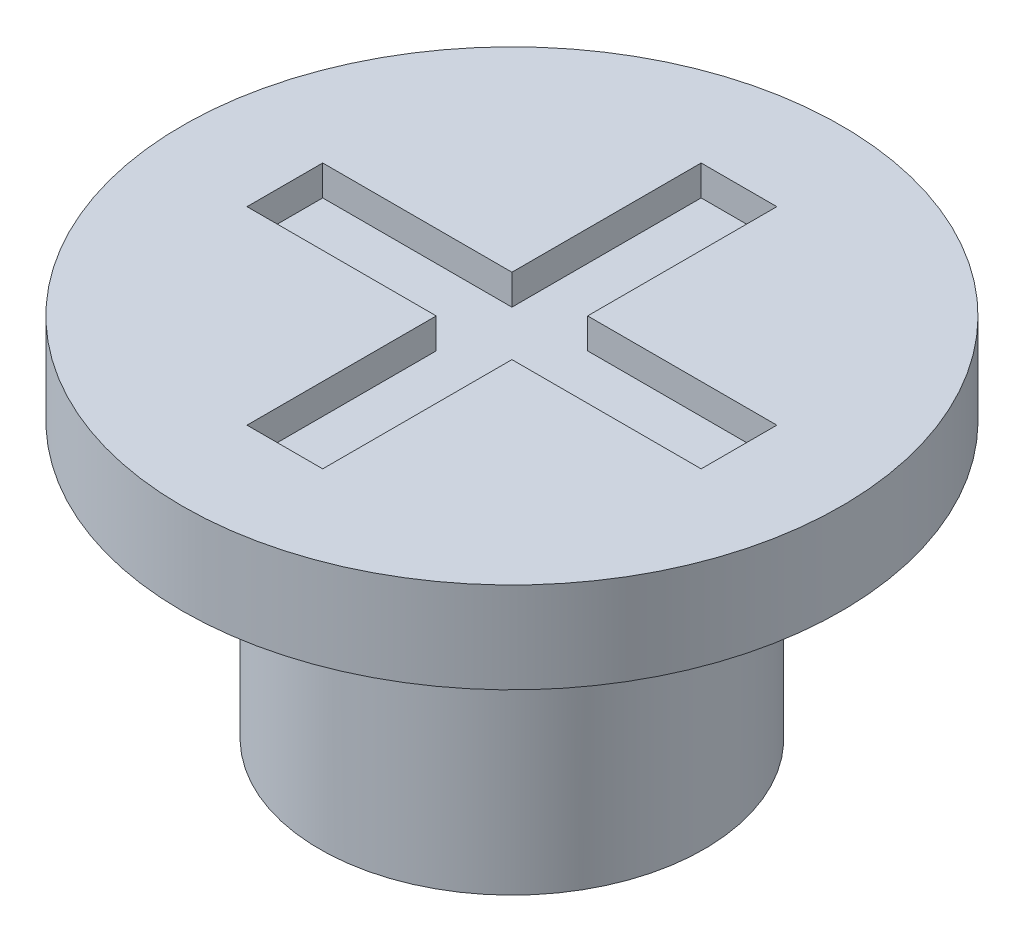
ISO-10303-21;
HEADER;
FILE_DESCRIPTION(('STEP AP214'),'2;1');
FILE_NAME('part.step','',(''),(''),'','','');
FILE_SCHEMA(('AUTOMOTIVE_DESIGN { 1 0 10303 214 1 1 1 1 }'));
ENDSEC;
DATA;
#1=APPLICATION_CONTEXT('core data for automotive mechanical design processes');
#2=APPLICATION_PROTOCOL_DEFINITION('international standard','automotive_design',2000,#1);
#3=PRODUCT_CONTEXT('',#1,'mechanical');
#4=PRODUCT('Part','Part','',(#3));
#5=PRODUCT_RELATED_PRODUCT_CATEGORY('part','',(#4));
#6=PRODUCT_DEFINITION_FORMATION('','',#4);
#7=PRODUCT_DEFINITION_CONTEXT('part definition',#1,'design');
#8=PRODUCT_DEFINITION('design','',#6,#7);
#9=PRODUCT_DEFINITION_SHAPE('','',#8);
#10=(LENGTH_UNIT() NAMED_UNIT(*) SI_UNIT(.MILLI.,.METRE.));
#11=(NAMED_UNIT(*) PLANE_ANGLE_UNIT() SI_UNIT($,.RADIAN.));
#12=(NAMED_UNIT(*) SI_UNIT($,.STERADIAN.) SOLID_ANGLE_UNIT());
#13=UNCERTAINTY_MEASURE_WITH_UNIT(LENGTH_MEASURE(1.E-05),#10,'distance_accuracy_value','');
#14=(GEOMETRIC_REPRESENTATION_CONTEXT(3) GLOBAL_UNCERTAINTY_ASSIGNED_CONTEXT((#13)) GLOBAL_UNIT_ASSIGNED_CONTEXT((#10,
#11,#12)) REPRESENTATION_CONTEXT('',''));
#15=CARTESIAN_POINT('',(0.,0.,0.));
#16=DIRECTION('',(0.,0.,1.));
#17=DIRECTION('',(1.,0.,0.));
#18=AXIS2_PLACEMENT_3D('',#15,#16,#17);
#19=CARTESIAN_POINT('',(0.,21.54,0.));
#20=DIRECTION('',(0.,-1.,0.));
#21=DIRECTION('',(0.,0.,-1.));
#22=AXIS2_PLACEMENT_3D('',#19,#20,#21);
#23=CYLINDRICAL_SURFACE('',#22,3.175);
#24=CARTESIAN_POINT('',(0.,21.54,0.));
#25=DIRECTION('',(0.,1.,0.));
#26=DIRECTION('',(0.,0.,1.));
#27=AXIS2_PLACEMENT_3D('',#24,#25,#26);
#28=CIRCLE('',#27,3.175);
#29=CARTESIAN_POINT('',(0.,21.54,3.175));
#30=VERTEX_POINT('',#29);
#31=EDGE_CURVE('E11',#30,#30,#28,.T.);
#32=ORIENTED_EDGE('',*,*,#31,.F.);
#33=EDGE_LOOP('',(#32));
#34=FACE_BOUND('',#33,.T.);
#35=CARTESIAN_POINT('',(0.,17.,0.));
#36=DIRECTION('',(0.,-1.,0.));
#37=DIRECTION('',(0.,0.,-1.));
#38=AXIS2_PLACEMENT_3D('',#35,#36,#37);
#39=CIRCLE('',#38,3.175);
#40=CARTESIAN_POINT('',(0.,17.,-3.175));
#41=VERTEX_POINT('',#40);
#42=EDGE_CURVE('E170',#41,#41,#39,.T.);
#43=ORIENTED_EDGE('',*,*,#42,.F.);
#44=EDGE_LOOP('',(#43));
#45=FACE_BOUND('',#44,.T.);
#46=ADVANCED_FACE('F43',(#34,#45),#23,.T.);
#47=CARTESIAN_POINT('',(0.,23.04,0.));
#48=DIRECTION('',(0.,-1.,0.));
#49=DIRECTION('',(0.,0.,-1.));
#50=AXIS2_PLACEMENT_3D('',#47,#48,#49);
#51=CYLINDRICAL_SURFACE('',#50,5.442868);
#52=CARTESIAN_POINT('',(0.,23.04,0.));
#53=DIRECTION('',(0.,1.,0.));
#54=DIRECTION('',(0.,0.,1.));
#55=AXIS2_PLACEMENT_3D('',#52,#53,#54);
#56=CIRCLE('',#55,5.442868);
#57=CARTESIAN_POINT('',(0.,23.04,5.442868));
#58=VERTEX_POINT('',#57);
#59=EDGE_CURVE('E50',#58,#58,#56,.T.);
#60=ORIENTED_EDGE('',*,*,#59,.F.);
#61=EDGE_LOOP('',(#60));
#62=FACE_BOUND('',#61,.T.);
#63=CARTESIAN_POINT('',(0.,21.54,0.));
#64=DIRECTION('',(0.,1.,0.));
#65=DIRECTION('',(0.,0.,1.));
#66=AXIS2_PLACEMENT_3D('',#63,#64,#65);
#67=CIRCLE('',#66,5.442868);
#68=CARTESIAN_POINT('',(0.,21.54,5.442868));
#69=VERTEX_POINT('',#68);
#70=EDGE_CURVE('E201',#69,#69,#67,.T.);
#71=ORIENTED_EDGE('',*,*,#70,.T.);
#72=EDGE_LOOP('',(#71));
#73=FACE_BOUND('',#72,.T.);
#74=ADVANCED_FACE('F223',(#62,#73),#51,.T.);
#75=CARTESIAN_POINT('',(0.,23.04,0.));
#76=DIRECTION('',(0.,1.,0.));
#77=DIRECTION('',(0.,0.,1.));
#78=AXIS2_PLACEMENT_3D('',#75,#76,#77);
#79=PLANE('',#78);
#80=DIRECTION('',(0.,0.,-1.));
#81=VECTOR('',#80,1.);
#82=CARTESIAN_POINT('',(0.625,23.04,0.));
#83=LINE('',#82,#81);
#84=CARTESIAN_POINT('',(0.625,23.04,3.75));
#85=VERTEX_POINT('',#84);
#86=CARTESIAN_POINT('',(0.625,23.04,0.625));
#87=VERTEX_POINT('',#86);
#88=EDGE_CURVE('E57',#85,#87,#83,.T.);
#89=ORIENTED_EDGE('',*,*,#88,.F.);
#90=DIRECTION('',(1.,0.,0.));
#91=VECTOR('',#90,1.);
#92=CARTESIAN_POINT('',(0.,23.04,3.75));
#93=LINE('',#92,#91);
#94=CARTESIAN_POINT('',(-0.625,23.04,3.75));
#95=VERTEX_POINT('',#94);
#96=EDGE_CURVE('E197',#95,#85,#93,.T.);
#97=ORIENTED_EDGE('',*,*,#96,.F.);
#98=DIRECTION('',(0.,0.,-1.));
#99=VECTOR('',#98,1.);
#100=CARTESIAN_POINT('',(-0.625,23.04,0.));
#101=LINE('',#100,#99);
#102=CARTESIAN_POINT('',(-0.625,23.04,0.625));
#103=VERTEX_POINT('',#102);
#104=EDGE_CURVE('E195',#95,#103,#101,.T.);
#105=ORIENTED_EDGE('',*,*,#104,.T.);
#106=DIRECTION('',(-1.,0.,0.));
#107=VECTOR('',#106,1.);
#108=CARTESIAN_POINT('',(0.,23.04,0.625));
#109=LINE('',#108,#107);
#110=CARTESIAN_POINT('',(-3.75,23.04,0.625000000000001));
#111=VERTEX_POINT('',#110);
#112=EDGE_CURVE('E152',#103,#111,#109,.T.);
#113=ORIENTED_EDGE('',*,*,#112,.T.);
#114=DIRECTION('',(0.,0.,-1.));
#115=VECTOR('',#114,1.);
#116=CARTESIAN_POINT('',(-3.75,23.04,0.));
#117=LINE('',#116,#115);
#118=CARTESIAN_POINT('',(-3.75,23.04,-0.624999999999999));
#119=VERTEX_POINT('',#118);
#120=EDGE_CURVE('E191',#111,#119,#117,.T.);
#121=ORIENTED_EDGE('',*,*,#120,.T.);
#122=DIRECTION('',(-1.,0.,0.));
#123=VECTOR('',#122,1.);
#124=CARTESIAN_POINT('',(0.,23.04,-0.625));
#125=LINE('',#124,#123);
#126=CARTESIAN_POINT('',(-0.625,23.04,-0.625));
#127=VERTEX_POINT('',#126);
#128=EDGE_CURVE('E188',#127,#119,#125,.T.);
#129=ORIENTED_EDGE('',*,*,#128,.F.);
#130=DIRECTION('',(0.,0.,-1.));
#131=VECTOR('',#130,1.);
#132=CARTESIAN_POINT('',(-0.625,23.04,0.));
#133=LINE('',#132,#131);
#134=CARTESIAN_POINT('',(-0.625,23.04,-3.75));
#135=VERTEX_POINT('',#134);
#136=EDGE_CURVE('E185',#127,#135,#133,.T.);
#137=ORIENTED_EDGE('',*,*,#136,.T.);
#138=DIRECTION('',(1.,0.,0.));
#139=VECTOR('',#138,1.);
#140=CARTESIAN_POINT('',(0.,23.04,-3.75));
#141=LINE('',#140,#139);
#142=CARTESIAN_POINT('',(0.625,23.04,-3.75));
#143=VERTEX_POINT('',#142);
#144=EDGE_CURVE('E182',#135,#143,#141,.T.);
#145=ORIENTED_EDGE('',*,*,#144,.T.);
#146=DIRECTION('',(0.,0.,-1.));
#147=VECTOR('',#146,1.);
#148=CARTESIAN_POINT('',(0.625,23.04,0.));
#149=LINE('',#148,#147);
#150=CARTESIAN_POINT('',(0.625,23.04,-0.625));
#151=VERTEX_POINT('',#150);
#152=EDGE_CURVE('E179',#151,#143,#149,.T.);
#153=ORIENTED_EDGE('',*,*,#152,.F.);
#154=DIRECTION('',(-1.,0.,0.));
#155=VECTOR('',#154,1.);
#156=CARTESIAN_POINT('',(0.,23.04,-0.625));
#157=LINE('',#156,#155);
#158=CARTESIAN_POINT('',(3.75,23.04,-0.625));
#159=VERTEX_POINT('',#158);
#160=EDGE_CURVE('E176',#159,#151,#157,.T.);
#161=ORIENTED_EDGE('',*,*,#160,.F.);
#162=DIRECTION('',(0.,0.,-1.));
#163=VECTOR('',#162,1.);
#164=CARTESIAN_POINT('',(3.75,23.04,0.));
#165=LINE('',#164,#163);
#166=CARTESIAN_POINT('',(3.75,23.04,0.625));
#167=VERTEX_POINT('',#166);
#168=EDGE_CURVE('E173',#167,#159,#165,.T.);
#169=ORIENTED_EDGE('',*,*,#168,.F.);
#170=DIRECTION('',(-1.,0.,0.));
#171=VECTOR('',#170,1.);
#172=CARTESIAN_POINT('',(0.,23.04,0.625));
#173=LINE('',#172,#171);
#174=EDGE_CURVE('E169',#167,#87,#173,.T.);
#175=ORIENTED_EDGE('',*,*,#174,.T.);
#176=EDGE_LOOP('',(#89,#97,#105,#113,#121,#129,#137,#145,#153,#161,#169,#175));
#177=FACE_BOUND('',#176,.T.);
#178=ORIENTED_EDGE('',*,*,#59,.T.);
#179=EDGE_LOOP('',(#178));
#180=FACE_BOUND('',#179,.T.);
#181=ADVANCED_FACE('F228',(#177,#180),#79,.T.);
#182=CARTESIAN_POINT('',(0.,21.54,0.));
#183=DIRECTION('',(0.,1.,0.));
#184=DIRECTION('',(0.,0.,1.));
#185=AXIS2_PLACEMENT_3D('',#182,#183,#184);
#186=PLANE('',#185);
#187=ORIENTED_EDGE('',*,*,#31,.T.);
#188=EDGE_LOOP('',(#187));
#189=FACE_BOUND('',#188,.T.);
#190=ORIENTED_EDGE('',*,*,#70,.F.);
#191=EDGE_LOOP('',(#190));
#192=FACE_BOUND('',#191,.T.);
#193=ADVANCED_FACE('F225',(#189,#192),#186,.F.);
#194=CARTESIAN_POINT('',(0.625,22.54,0.));
#195=DIRECTION('',(1.,0.,0.));
#196=DIRECTION('',(0.,0.,-1.));
#197=AXIS2_PLACEMENT_3D('',#194,#195,#196);
#198=PLANE('',#197);
#199=ORIENTED_EDGE('',*,*,#88,.T.);
#200=DIRECTION('',(0.,1.,0.));
#201=VECTOR('',#200,1.);
#202=CARTESIAN_POINT('',(0.625,22.54,0.625));
#203=LINE('',#202,#201);
#204=CARTESIAN_POINT('',(0.625,22.54,0.625));
#205=VERTEX_POINT('',#204);
#206=EDGE_CURVE('E167',#205,#87,#203,.T.);
#207=ORIENTED_EDGE('',*,*,#206,.F.);
#208=DIRECTION('',(0.,0.,-1.));
#209=VECTOR('',#208,1.);
#210=CARTESIAN_POINT('',(0.625,22.54,0.));
#211=LINE('',#210,#209);
#212=CARTESIAN_POINT('',(0.625,22.54,3.75));
#213=VERTEX_POINT('',#212);
#214=EDGE_CURVE('E199',#213,#205,#211,.T.);
#215=ORIENTED_EDGE('',*,*,#214,.F.);
#216=DIRECTION('',(0.,1.,0.));
#217=VECTOR('',#216,1.);
#218=CARTESIAN_POINT('',(0.625,22.54,3.75));
#219=LINE('',#218,#217);
#220=EDGE_CURVE('E65',#213,#85,#219,.T.);
#221=ORIENTED_EDGE('',*,*,#220,.T.);
#222=EDGE_LOOP('',(#199,#207,#215,#221));
#223=FACE_BOUND('',#222,.T.);
#224=ADVANCED_FACE('F227',(#223),#198,.F.);
#225=CARTESIAN_POINT('',(0.,22.54,3.75));
#226=DIRECTION('',(0.,0.,1.));
#227=DIRECTION('',(1.,0.,0.));
#228=AXIS2_PLACEMENT_3D('',#225,#226,#227);
#229=PLANE('',#228);
#230=ORIENTED_EDGE('',*,*,#96,.T.);
#231=ORIENTED_EDGE('',*,*,#220,.F.);
#232=DIRECTION('',(1.,0.,0.));
#233=VECTOR('',#232,1.);
#234=CARTESIAN_POINT('',(0.,22.54,3.75));
#235=LINE('',#234,#233);
#236=CARTESIAN_POINT('',(-0.625,22.54,3.75));
#237=VERTEX_POINT('',#236);
#238=EDGE_CURVE('E145',#237,#213,#235,.T.);
#239=ORIENTED_EDGE('',*,*,#238,.F.);
#240=DIRECTION('',(0.,1.,0.));
#241=VECTOR('',#240,1.);
#242=CARTESIAN_POINT('',(-0.625,22.54,3.75));
#243=LINE('',#242,#241);
#244=EDGE_CURVE('E141',#237,#95,#243,.T.);
#245=ORIENTED_EDGE('',*,*,#244,.T.);
#246=EDGE_LOOP('',(#230,#231,#239,#245));
#247=FACE_BOUND('',#246,.T.);
#248=ADVANCED_FACE('F235',(#247),#229,.F.);
#249=CARTESIAN_POINT('',(-0.625,22.54,0.));
#250=DIRECTION('',(1.,0.,0.));
#251=DIRECTION('',(0.,0.,-1.));
#252=AXIS2_PLACEMENT_3D('',#249,#250,#251);
#253=PLANE('',#252);
#254=ORIENTED_EDGE('',*,*,#104,.F.);
#255=ORIENTED_EDGE('',*,*,#244,.F.);
#256=DIRECTION('',(0.,0.,-1.));
#257=VECTOR('',#256,1.);
#258=CARTESIAN_POINT('',(-0.625,22.54,0.));
#259=LINE('',#258,#257);
#260=CARTESIAN_POINT('',(-0.625,22.54,0.625));
#261=VERTEX_POINT('',#260);
#262=EDGE_CURVE('E135',#237,#261,#259,.T.);
#263=ORIENTED_EDGE('',*,*,#262,.T.);
#264=DIRECTION('',(0.,1.,0.));
#265=VECTOR('',#264,1.);
#266=CARTESIAN_POINT('',(-0.625,22.54,0.625));
#267=LINE('',#266,#265);
#268=EDGE_CURVE('E139',#261,#103,#267,.T.);
#269=ORIENTED_EDGE('',*,*,#268,.T.);
#270=EDGE_LOOP('',(#254,#255,#263,#269));
#271=FACE_BOUND('',#270,.T.);
#272=ADVANCED_FACE('F138',(#271),#253,.T.);
#273=CARTESIAN_POINT('',(0.,22.54,0.625));
#274=DIRECTION('',(0.,0.,-1.));
#275=DIRECTION('',(-1.,0.,0.));
#276=AXIS2_PLACEMENT_3D('',#273,#274,#275);
#277=PLANE('',#276);
#278=ORIENTED_EDGE('',*,*,#112,.F.);
#279=ORIENTED_EDGE('',*,*,#268,.F.);
#280=DIRECTION('',(-1.,0.,0.));
#281=VECTOR('',#280,1.);
#282=CARTESIAN_POINT('',(0.,22.54,0.625));
#283=LINE('',#282,#281);
#284=CARTESIAN_POINT('',(-3.75,22.54,0.625000000000001));
#285=VERTEX_POINT('',#284);
#286=EDGE_CURVE('E146',#261,#285,#283,.T.);
#287=ORIENTED_EDGE('',*,*,#286,.T.);
#288=DIRECTION('',(0.,1.,0.));
#289=VECTOR('',#288,1.);
#290=CARTESIAN_POINT('',(-3.75,22.54,0.625000000000001));
#291=LINE('',#290,#289);
#292=EDGE_CURVE('E154',#285,#111,#291,.T.);
#293=ORIENTED_EDGE('',*,*,#292,.T.);
#294=EDGE_LOOP('',(#278,#279,#287,#293));
#295=FACE_BOUND('',#294,.T.);
#296=ADVANCED_FACE('F149',(#295),#277,.T.);
#297=CARTESIAN_POINT('',(-3.75,22.54,0.));
#298=DIRECTION('',(1.,0.,0.));
#299=DIRECTION('',(0.,0.,-1.));
#300=AXIS2_PLACEMENT_3D('',#297,#298,#299);
#301=PLANE('',#300);
#302=ORIENTED_EDGE('',*,*,#120,.F.);
#303=ORIENTED_EDGE('',*,*,#292,.F.);
#304=DIRECTION('',(0.,0.,-1.));
#305=VECTOR('',#304,1.);
#306=CARTESIAN_POINT('',(-3.75,22.54,0.));
#307=LINE('',#306,#305);
#308=CARTESIAN_POINT('',(-3.75,22.54,-0.624999999999999));
#309=VERTEX_POINT('',#308);
#310=EDGE_CURVE('E160',#285,#309,#307,.T.);
#311=ORIENTED_EDGE('',*,*,#310,.T.);
#312=DIRECTION('',(0.,1.,0.));
#313=VECTOR('',#312,1.);
#314=CARTESIAN_POINT('',(-3.75,22.54,-0.624999999999999));
#315=LINE('',#314,#313);
#316=EDGE_CURVE('E204',#309,#119,#315,.T.);
#317=ORIENTED_EDGE('',*,*,#316,.T.);
#318=EDGE_LOOP('',(#302,#303,#311,#317));
#319=FACE_BOUND('',#318,.T.);
#320=ADVANCED_FACE('F278',(#319),#301,.T.);
#321=CARTESIAN_POINT('',(0.,22.54,-0.625));
#322=DIRECTION('',(0.,0.,-1.));
#323=DIRECTION('',(-1.,0.,0.));
#324=AXIS2_PLACEMENT_3D('',#321,#322,#323);
#325=PLANE('',#324);
#326=ORIENTED_EDGE('',*,*,#128,.T.);
#327=ORIENTED_EDGE('',*,*,#316,.F.);
#328=DIRECTION('',(-1.,0.,0.));
#329=VECTOR('',#328,1.);
#330=CARTESIAN_POINT('',(0.,22.54,-0.625));
#331=LINE('',#330,#329);
#332=CARTESIAN_POINT('',(-0.625,22.54,-0.625));
#333=VERTEX_POINT('',#332);
#334=EDGE_CURVE('E162',#333,#309,#331,.T.);
#335=ORIENTED_EDGE('',*,*,#334,.F.);
#336=DIRECTION('',(0.,1.,0.));
#337=VECTOR('',#336,1.);
#338=CARTESIAN_POINT('',(-0.625,22.54,-0.625));
#339=LINE('',#338,#337);
#340=EDGE_CURVE('E206',#333,#127,#339,.T.);
#341=ORIENTED_EDGE('',*,*,#340,.T.);
#342=EDGE_LOOP('',(#326,#327,#335,#341));
#343=FACE_BOUND('',#342,.T.);
#344=ADVANCED_FACE('F273',(#343),#325,.F.);
#345=CARTESIAN_POINT('',(-0.625,22.54,0.));
#346=DIRECTION('',(1.,0.,0.));
#347=DIRECTION('',(0.,0.,-1.));
#348=AXIS2_PLACEMENT_3D('',#345,#346,#347);
#349=PLANE('',#348);
#350=ORIENTED_EDGE('',*,*,#136,.F.);
#351=ORIENTED_EDGE('',*,*,#340,.F.);
#352=DIRECTION('',(0.,0.,-1.));
#353=VECTOR('',#352,1.);
#354=CARTESIAN_POINT('',(-0.625,22.54,0.));
#355=LINE('',#354,#353);
#356=CARTESIAN_POINT('',(-0.625,22.54,-3.75));
#357=VERTEX_POINT('',#356);
#358=EDGE_CURVE('E267',#333,#357,#355,.T.);
#359=ORIENTED_EDGE('',*,*,#358,.T.);
#360=DIRECTION('',(0.,1.,0.));
#361=VECTOR('',#360,1.);
#362=CARTESIAN_POINT('',(-0.625,22.54,-3.75));
#363=LINE('',#362,#361);
#364=EDGE_CURVE('E208',#357,#135,#363,.T.);
#365=ORIENTED_EDGE('',*,*,#364,.T.);
#366=EDGE_LOOP('',(#350,#351,#359,#365));
#367=FACE_BOUND('',#366,.T.);
#368=ADVANCED_FACE('F301',(#367),#349,.T.);
#369=CARTESIAN_POINT('',(0.,22.54,-3.75));
#370=DIRECTION('',(0.,0.,1.));
#371=DIRECTION('',(1.,0.,0.));
#372=AXIS2_PLACEMENT_3D('',#369,#370,#371);
#373=PLANE('',#372);
#374=ORIENTED_EDGE('',*,*,#144,.F.);
#375=ORIENTED_EDGE('',*,*,#364,.F.);
#376=DIRECTION('',(1.,0.,0.));
#377=VECTOR('',#376,1.);
#378=CARTESIAN_POINT('',(0.,22.54,-3.75));
#379=LINE('',#378,#377);
#380=CARTESIAN_POINT('',(0.625,22.54,-3.75));
#381=VERTEX_POINT('',#380);
#382=EDGE_CURVE('E265',#357,#381,#379,.T.);
#383=ORIENTED_EDGE('',*,*,#382,.T.);
#384=DIRECTION('',(0.,1.,0.));
#385=VECTOR('',#384,1.);
#386=CARTESIAN_POINT('',(0.625,22.54,-3.75));
#387=LINE('',#386,#385);
#388=EDGE_CURVE('E210',#381,#143,#387,.T.);
#389=ORIENTED_EDGE('',*,*,#388,.T.);
#390=EDGE_LOOP('',(#374,#375,#383,#389));
#391=FACE_BOUND('',#390,.T.);
#392=ADVANCED_FACE('F298',(#391),#373,.T.);
#393=CARTESIAN_POINT('',(0.625,22.54,0.));
#394=DIRECTION('',(1.,0.,0.));
#395=DIRECTION('',(0.,0.,-1.));
#396=AXIS2_PLACEMENT_3D('',#393,#394,#395);
#397=PLANE('',#396);
#398=ORIENTED_EDGE('',*,*,#152,.T.);
#399=ORIENTED_EDGE('',*,*,#388,.F.);
#400=DIRECTION('',(0.,0.,-1.));
#401=VECTOR('',#400,1.);
#402=CARTESIAN_POINT('',(0.625,22.54,0.));
#403=LINE('',#402,#401);
#404=CARTESIAN_POINT('',(0.625,22.54,-0.625));
#405=VERTEX_POINT('',#404);
#406=EDGE_CURVE('E262',#405,#381,#403,.T.);
#407=ORIENTED_EDGE('',*,*,#406,.F.);
#408=DIRECTION('',(0.,1.,0.));
#409=VECTOR('',#408,1.);
#410=CARTESIAN_POINT('',(0.625,22.54,-0.625));
#411=LINE('',#410,#409);
#412=EDGE_CURVE('E212',#405,#151,#411,.T.);
#413=ORIENTED_EDGE('',*,*,#412,.T.);
#414=EDGE_LOOP('',(#398,#399,#407,#413));
#415=FACE_BOUND('',#414,.T.);
#416=ADVANCED_FACE('F295',(#415),#397,.F.);
#417=CARTESIAN_POINT('',(0.,22.54,-0.625));
#418=DIRECTION('',(0.,0.,-1.));
#419=DIRECTION('',(-1.,0.,0.));
#420=AXIS2_PLACEMENT_3D('',#417,#418,#419);
#421=PLANE('',#420);
#422=ORIENTED_EDGE('',*,*,#160,.T.);
#423=ORIENTED_EDGE('',*,*,#412,.F.);
#424=DIRECTION('',(-1.,0.,0.));
#425=VECTOR('',#424,1.);
#426=CARTESIAN_POINT('',(0.,22.54,-0.625));
#427=LINE('',#426,#425);
#428=CARTESIAN_POINT('',(3.75,22.54,-0.625));
#429=VERTEX_POINT('',#428);
#430=EDGE_CURVE('E259',#429,#405,#427,.T.);
#431=ORIENTED_EDGE('',*,*,#430,.F.);
#432=DIRECTION('',(0.,1.,0.));
#433=VECTOR('',#432,1.);
#434=CARTESIAN_POINT('',(3.75,22.54,-0.625));
#435=LINE('',#434,#433);
#436=EDGE_CURVE('E214',#429,#159,#435,.T.);
#437=ORIENTED_EDGE('',*,*,#436,.T.);
#438=EDGE_LOOP('',(#422,#423,#431,#437));
#439=FACE_BOUND('',#438,.T.);
#440=ADVANCED_FACE('F292',(#439),#421,.F.);
#441=CARTESIAN_POINT('',(3.75,22.54,0.));
#442=DIRECTION('',(1.,0.,0.));
#443=DIRECTION('',(0.,0.,-1.));
#444=AXIS2_PLACEMENT_3D('',#441,#442,#443);
#445=PLANE('',#444);
#446=ORIENTED_EDGE('',*,*,#168,.T.);
#447=ORIENTED_EDGE('',*,*,#436,.F.);
#448=DIRECTION('',(0.,0.,-1.));
#449=VECTOR('',#448,1.);
#450=CARTESIAN_POINT('',(3.75,22.54,0.));
#451=LINE('',#450,#449);
#452=CARTESIAN_POINT('',(3.75,22.54,0.625));
#453=VERTEX_POINT('',#452);
#454=EDGE_CURVE('E256',#453,#429,#451,.T.);
#455=ORIENTED_EDGE('',*,*,#454,.F.);
#456=DIRECTION('',(0.,1.,0.));
#457=VECTOR('',#456,1.);
#458=CARTESIAN_POINT('',(3.75,22.54,0.625));
#459=LINE('',#458,#457);
#460=EDGE_CURVE('E216',#453,#167,#459,.T.);
#461=ORIENTED_EDGE('',*,*,#460,.T.);
#462=EDGE_LOOP('',(#446,#447,#455,#461));
#463=FACE_BOUND('',#462,.T.);
#464=ADVANCED_FACE('F288',(#463),#445,.F.);
#465=CARTESIAN_POINT('',(0.,22.54,0.625));
#466=DIRECTION('',(0.,0.,-1.));
#467=DIRECTION('',(-1.,0.,0.));
#468=AXIS2_PLACEMENT_3D('',#465,#466,#467);
#469=PLANE('',#468);
#470=ORIENTED_EDGE('',*,*,#174,.F.);
#471=ORIENTED_EDGE('',*,*,#460,.F.);
#472=DIRECTION('',(-1.,0.,0.));
#473=VECTOR('',#472,1.);
#474=CARTESIAN_POINT('',(0.,22.54,0.625));
#475=LINE('',#474,#473);
#476=EDGE_CURVE('E109',#453,#205,#475,.T.);
#477=ORIENTED_EDGE('',*,*,#476,.T.);
#478=ORIENTED_EDGE('',*,*,#206,.T.);
#479=EDGE_LOOP('',(#470,#471,#477,#478));
#480=FACE_BOUND('',#479,.T.);
#481=ADVANCED_FACE('F283',(#480),#469,.T.);
#482=CARTESIAN_POINT('',(0.,22.54,0.));
#483=DIRECTION('',(0.,1.,0.));
#484=DIRECTION('',(0.,0.,1.));
#485=AXIS2_PLACEMENT_3D('',#482,#483,#484);
#486=PLANE('',#485);
#487=ORIENTED_EDGE('',*,*,#214,.T.);
#488=ORIENTED_EDGE('',*,*,#476,.F.);
#489=ORIENTED_EDGE('',*,*,#454,.T.);
#490=ORIENTED_EDGE('',*,*,#430,.T.);
#491=ORIENTED_EDGE('',*,*,#406,.T.);
#492=ORIENTED_EDGE('',*,*,#382,.F.);
#493=ORIENTED_EDGE('',*,*,#358,.F.);
#494=ORIENTED_EDGE('',*,*,#334,.T.);
#495=ORIENTED_EDGE('',*,*,#310,.F.);
#496=ORIENTED_EDGE('',*,*,#286,.F.);
#497=ORIENTED_EDGE('',*,*,#262,.F.);
#498=ORIENTED_EDGE('',*,*,#238,.T.);
#499=EDGE_LOOP('',(#487,#488,#489,#490,#491,#492,#493,#494,#495,#496,#497,#498));
#500=FACE_BOUND('',#499,.T.);
#501=ADVANCED_FACE('F158',(#500),#486,.T.);
#502=CARTESIAN_POINT('',(0.,17.,0.));
#503=DIRECTION('',(0.,-1.,0.));
#504=DIRECTION('',(0.,0.,-1.));
#505=AXIS2_PLACEMENT_3D('',#502,#503,#504);
#506=PLANE('',#505);
#507=ORIENTED_EDGE('',*,*,#42,.T.);
#508=EDGE_LOOP('',(#507));
#509=FACE_BOUND('',#508,.T.);
#510=ADVANCED_FACE('F322',(#509),#506,.T.);
#511=CLOSED_SHELL('',(#46,#74,#181,#193,#224,#248,#272,#296,#320,#344,#368,#392,#416,#440,#464,
#481,#501,#510));
#512=MANIFOLD_SOLID_BREP('B2',#511);
#513=ADVANCED_BREP_SHAPE_REPRESENTATION('',(#18,#512),#14);
#514=SHAPE_DEFINITION_REPRESENTATION(#9,#513);
ENDSEC;
END-ISO-10303-21;
